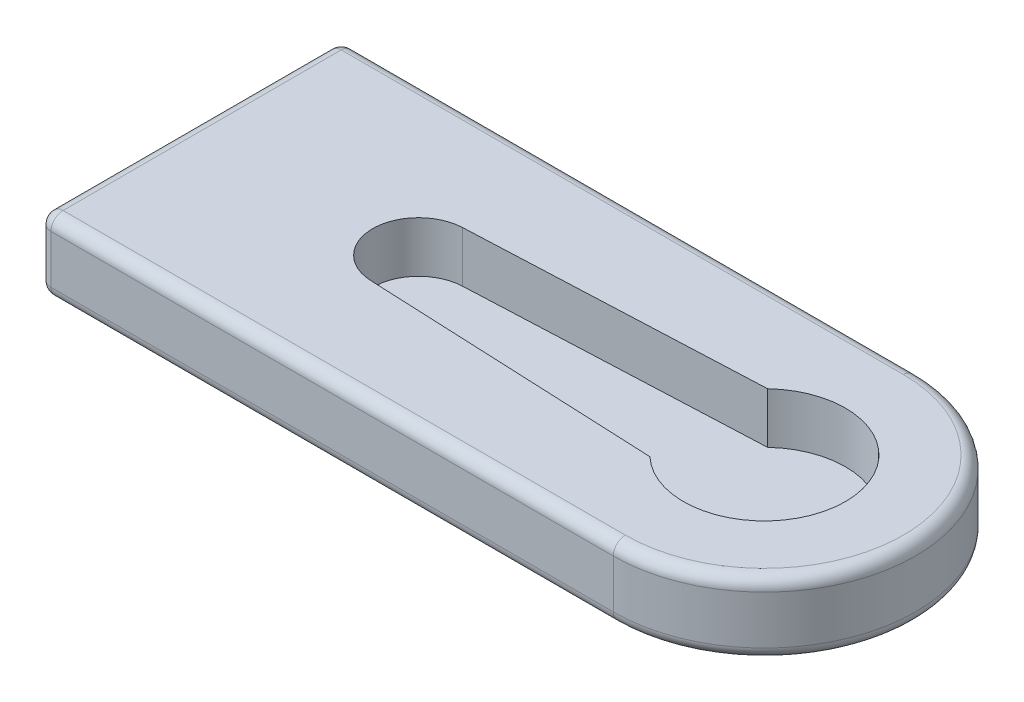
ISO-10303-21;
HEADER;
FILE_DESCRIPTION(('STEP AP214'),'2;1');
FILE_NAME('part.step','',(''),(''),'','','');
FILE_SCHEMA(('AUTOMOTIVE_DESIGN { 1 0 10303 214 1 1 1 1 }'));
ENDSEC;
DATA;
#1=APPLICATION_CONTEXT('core data for automotive mechanical design processes');
#2=APPLICATION_PROTOCOL_DEFINITION('international standard','automotive_design',2000,#1);
#3=PRODUCT_CONTEXT('',#1,'mechanical');
#4=PRODUCT('Part','Part','',(#3));
#5=PRODUCT_RELATED_PRODUCT_CATEGORY('part','',(#4));
#6=PRODUCT_DEFINITION_FORMATION('','',#4);
#7=PRODUCT_DEFINITION_CONTEXT('part definition',#1,'design');
#8=PRODUCT_DEFINITION('design','',#6,#7);
#9=PRODUCT_DEFINITION_SHAPE('','',#8);
#10=(LENGTH_UNIT() NAMED_UNIT(*) SI_UNIT(.MILLI.,.METRE.));
#11=(NAMED_UNIT(*) PLANE_ANGLE_UNIT() SI_UNIT($,.RADIAN.));
#12=(NAMED_UNIT(*) SI_UNIT($,.STERADIAN.) SOLID_ANGLE_UNIT());
#13=UNCERTAINTY_MEASURE_WITH_UNIT(LENGTH_MEASURE(1.E-05),#10,'distance_accuracy_value','');
#14=(GEOMETRIC_REPRESENTATION_CONTEXT(3) GLOBAL_UNCERTAINTY_ASSIGNED_CONTEXT((#13)) GLOBAL_UNIT_ASSIGNED_CONTEXT((#10,
#11,#12)) REPRESENTATION_CONTEXT('',''));
#15=CARTESIAN_POINT('',(0.,0.,0.));
#16=DIRECTION('',(0.,0.,1.));
#17=DIRECTION('',(1.,0.,0.));
#18=AXIS2_PLACEMENT_3D('',#15,#16,#17);
#19=CARTESIAN_POINT('',(0.,3.,0.));
#20=DIRECTION('',(1.,0.,0.));
#21=DIRECTION('',(0.,0.,-1.));
#22=AXIS2_PLACEMENT_3D('',#19,#20,#21);
#23=PLANE('',#22);
#24=DIRECTION('',(0.,0.,1.));
#25=VECTOR('',#24,1.);
#26=CARTESIAN_POINT('',(0.,2.5,-12.5));
#27=LINE('',#26,#25);
#28=CARTESIAN_POINT('',(0.,2.5,-0.5));
#29=VERTEX_POINT('',#28);
#30=CARTESIAN_POINT('',(0.,2.5,-12.));
#31=VERTEX_POINT('',#30);
#32=EDGE_CURVE('E242',#29,#31,#27,.F.);
#33=ORIENTED_EDGE('',*,*,#32,.T.);
#34=DIRECTION('',(0.,-1.,0.));
#35=VECTOR('',#34,1.);
#36=CARTESIAN_POINT('',(0.,3.,-12.));
#37=LINE('',#36,#35);
#38=CARTESIAN_POINT('',(0.,0.5,-12.));
#39=VERTEX_POINT('',#38);
#40=EDGE_CURVE('E249',#31,#39,#37,.T.);
#41=ORIENTED_EDGE('',*,*,#40,.T.);
#42=DIRECTION('',(0.,0.,1.));
#43=VECTOR('',#42,1.);
#44=CARTESIAN_POINT('',(0.,0.5,0.));
#45=LINE('',#44,#43);
#46=CARTESIAN_POINT('',(0.,0.5,-0.5));
#47=VERTEX_POINT('',#46);
#48=EDGE_CURVE('E245',#39,#47,#45,.T.);
#49=ORIENTED_EDGE('',*,*,#48,.T.);
#50=DIRECTION('',(0.,-1.,0.));
#51=VECTOR('',#50,1.);
#52=CARTESIAN_POINT('',(0.,3.,-0.5));
#53=LINE('',#52,#51);
#54=EDGE_CURVE('E239',#47,#29,#53,.F.);
#55=ORIENTED_EDGE('',*,*,#54,.T.);
#56=EDGE_LOOP('',(#33,#41,#49,#55));
#57=FACE_BOUND('',#56,.T.);
#58=ADVANCED_FACE('F39',(#57),#23,.F.);
#59=CARTESIAN_POINT('',(0.,3.,0.));
#60=DIRECTION('',(0.,0.,-1.));
#61=DIRECTION('',(-1.,0.,0.));
#62=AXIS2_PLACEMENT_3D('',#59,#60,#61);
#63=PLANE('',#62);
#64=DIRECTION('',(0.,-1.,0.));
#65=VECTOR('',#64,1.);
#66=CARTESIAN_POINT('',(0.5,3.,0.));
#67=LINE('',#66,#65);
#68=CARTESIAN_POINT('',(0.5,2.5,0.));
#69=VERTEX_POINT('',#68);
#70=CARTESIAN_POINT('',(0.5,0.5,0.));
#71=VERTEX_POINT('',#70);
#72=EDGE_CURVE('E201',#69,#71,#67,.T.);
#73=ORIENTED_EDGE('',*,*,#72,.T.);
#74=DIRECTION('',(1.,0.,0.));
#75=VECTOR('',#74,1.);
#76=CARTESIAN_POINT('',(0.,0.5,0.));
#77=LINE('',#76,#75);
#78=CARTESIAN_POINT('',(23.75,0.5,0.));
#79=VERTEX_POINT('',#78);
#80=EDGE_CURVE('E207',#71,#79,#77,.T.);
#81=ORIENTED_EDGE('',*,*,#80,.T.);
#82=DIRECTION('',(0.,-1.,0.));
#83=VECTOR('',#82,1.);
#84=CARTESIAN_POINT('',(23.75,3.,0.));
#85=LINE('',#84,#83);
#86=CARTESIAN_POINT('',(23.75,2.5,0.));
#87=VERTEX_POINT('',#86);
#88=EDGE_CURVE('E197',#87,#79,#85,.T.);
#89=ORIENTED_EDGE('',*,*,#88,.F.);
#90=DIRECTION('',(1.,0.,0.));
#91=VECTOR('',#90,1.);
#92=CARTESIAN_POINT('',(0.,2.5,0.));
#93=LINE('',#92,#91);
#94=EDGE_CURVE('E204',#87,#69,#93,.F.);
#95=ORIENTED_EDGE('',*,*,#94,.T.);
#96=EDGE_LOOP('',(#73,#81,#89,#95));
#97=FACE_BOUND('',#96,.T.);
#98=ADVANCED_FACE('F347',(#97),#63,.F.);
#99=CARTESIAN_POINT('',(23.75,3.,-6.25));
#100=DIRECTION('',(0.,-1.,0.));
#101=DIRECTION('',(0.,0.,-1.));
#102=AXIS2_PLACEMENT_3D('',#99,#100,#101);
#103=CYLINDRICAL_SURFACE('',#102,6.25);
#104=ORIENTED_EDGE('',*,*,#88,.T.);
#105=CARTESIAN_POINT('',(23.75,0.5,-6.25));
#106=DIRECTION('',(0.,1.,0.));
#107=DIRECTION('',(0.,0.,1.));
#108=AXIS2_PLACEMENT_3D('',#105,#106,#107);
#109=CIRCLE('',#108,6.25);
#110=CARTESIAN_POINT('',(23.75,0.5,-12.5));
#111=VERTEX_POINT('',#110);
#112=EDGE_CURVE('E227',#79,#111,#109,.T.);
#113=ORIENTED_EDGE('',*,*,#112,.T.);
#114=DIRECTION('',(0.,-1.,0.));
#115=VECTOR('',#114,1.);
#116=CARTESIAN_POINT('',(23.75,3.,-12.5));
#117=LINE('',#116,#115);
#118=CARTESIAN_POINT('',(23.75,2.5,-12.5));
#119=VERTEX_POINT('',#118);
#120=EDGE_CURVE('E193',#119,#111,#117,.T.);
#121=ORIENTED_EDGE('',*,*,#120,.F.);
#122=CARTESIAN_POINT('',(23.75,2.5,-6.25));
#123=DIRECTION('',(0.,1.,0.));
#124=DIRECTION('',(0.,0.,1.));
#125=AXIS2_PLACEMENT_3D('',#122,#123,#124);
#126=CIRCLE('',#125,6.25);
#127=EDGE_CURVE('E224',#119,#87,#126,.F.);
#128=ORIENTED_EDGE('',*,*,#127,.T.);
#129=EDGE_LOOP('',(#104,#113,#121,#128));
#130=FACE_BOUND('',#129,.T.);
#131=ADVANCED_FACE('F351',(#130),#103,.T.);
#132=CARTESIAN_POINT('',(0.,3.,-12.5));
#133=DIRECTION('',(0.,0.,1.));
#134=DIRECTION('',(1.,0.,0.));
#135=AXIS2_PLACEMENT_3D('',#132,#133,#134);
#136=PLANE('',#135);
#137=ORIENTED_EDGE('',*,*,#120,.T.);
#138=DIRECTION('',(-1.,0.,0.));
#139=VECTOR('',#138,1.);
#140=CARTESIAN_POINT('',(0.,0.5,-12.5));
#141=LINE('',#140,#139);
#142=CARTESIAN_POINT('',(0.499999999999993,0.5,-12.5));
#143=VERTEX_POINT('',#142);
#144=EDGE_CURVE('E236',#111,#143,#141,.T.);
#145=ORIENTED_EDGE('',*,*,#144,.T.);
#146=DIRECTION('',(0.,-1.,0.));
#147=VECTOR('',#146,1.);
#148=CARTESIAN_POINT('',(0.499999999999993,3.,-12.5));
#149=LINE('',#148,#147);
#150=CARTESIAN_POINT('',(0.499999999999993,2.5,-12.5));
#151=VERTEX_POINT('',#150);
#152=EDGE_CURVE('E230',#143,#151,#149,.F.);
#153=ORIENTED_EDGE('',*,*,#152,.T.);
#154=DIRECTION('',(-1.,0.,0.));
#155=VECTOR('',#154,1.);
#156=CARTESIAN_POINT('',(23.75,2.5,-12.5));
#157=LINE('',#156,#155);
#158=EDGE_CURVE('E233',#151,#119,#157,.F.);
#159=ORIENTED_EDGE('',*,*,#158,.T.);
#160=EDGE_LOOP('',(#137,#145,#153,#159));
#161=FACE_BOUND('',#160,.T.);
#162=ADVANCED_FACE('F356',(#161),#136,.F.);
#163=CARTESIAN_POINT('',(23.75,3.,-6.25));
#164=DIRECTION('',(0.,1.,0.));
#165=DIRECTION('',(0.,0.,1.));
#166=AXIS2_PLACEMENT_3D('',#163,#164,#165);
#167=PLANE('',#166);
#168=CARTESIAN_POINT('',(9.45,3.,-6.25));
#169=DIRECTION('',(0.,1.,0.));
#170=DIRECTION('',(0.,0.,-1.));
#171=AXIS2_PLACEMENT_3D('',#168,#169,#170);
#172=CIRCLE('',#171,1.9);
#173=CARTESIAN_POINT('',(9.36583663711021,3.,-8.14813501320298));
#174=VERTEX_POINT('',#173);
#175=CARTESIAN_POINT('',(9.36583663711021,3.,-4.35186498679702));
#176=VERTEX_POINT('',#175);
#177=EDGE_CURVE('E57',#174,#176,#172,.T.);
#178=ORIENTED_EDGE('',*,*,#177,.F.);
#179=DIRECTION('',(-0.999018428001569,0.,0.0442965067840975));
#180=VECTOR('',#179,1.);
#181=CARTESIAN_POINT('',(9.36583663711021,3.,-8.14813501320298));
#182=LINE('',#181,#180);
#183=CARTESIAN_POINT('',(21.4480845876229,3.,-8.68386224636088));
#184=VERTEX_POINT('',#183);
#185=EDGE_CURVE('E165',#184,#174,#182,.T.);
#186=ORIENTED_EDGE('',*,*,#185,.F.);
#187=CARTESIAN_POINT('',(23.75,3.,-6.25));
#188=DIRECTION('',(0.,1.,0.));
#189=DIRECTION('',(0.,0.,1.));
#190=AXIS2_PLACEMENT_3D('',#187,#188,#189);
#191=CIRCLE('',#190,3.35);
#192=CARTESIAN_POINT('',(21.4480845876229,3.,-3.81613775363912));
#193=VERTEX_POINT('',#192);
#194=EDGE_CURVE('E169',#193,#184,#191,.T.);
#195=ORIENTED_EDGE('',*,*,#194,.F.);
#196=DIRECTION('',(0.999018428001569,0.,0.0442965067840975));
#197=VECTOR('',#196,1.);
#198=CARTESIAN_POINT('',(9.36583663711021,3.,-4.35186498679702));
#199=LINE('',#198,#197);
#200=EDGE_CURVE('E178',#176,#193,#199,.T.);
#201=ORIENTED_EDGE('',*,*,#200,.F.);
#202=EDGE_LOOP('',(#178,#186,#195,#201));
#203=FACE_BOUND('',#202,.T.);
#204=CARTESIAN_POINT('',(23.75,3.,-6.25));
#205=DIRECTION('',(0.,1.,0.));
#206=DIRECTION('',(0.,0.,1.));
#207=AXIS2_PLACEMENT_3D('',#204,#205,#206);
#208=CIRCLE('',#207,5.75);
#209=CARTESIAN_POINT('',(23.75,3.,-0.5));
#210=VERTEX_POINT('',#209);
#211=CARTESIAN_POINT('',(23.75,3.,-12.));
#212=VERTEX_POINT('',#211);
#213=EDGE_CURVE('E49',#210,#212,#208,.T.);
#214=ORIENTED_EDGE('',*,*,#213,.T.);
#215=DIRECTION('',(-1.,0.,0.));
#216=VECTOR('',#215,1.);
#217=CARTESIAN_POINT('',(0.,3.,-12.));
#218=LINE('',#217,#216);
#219=CARTESIAN_POINT('',(0.499999999999994,3.,-12.));
#220=VERTEX_POINT('',#219);
#221=EDGE_CURVE('E11',#212,#220,#218,.T.);
#222=ORIENTED_EDGE('',*,*,#221,.T.);
#223=DIRECTION('',(0.,0.,1.));
#224=VECTOR('',#223,1.);
#225=CARTESIAN_POINT('',(0.5,3.,0.));
#226=LINE('',#225,#224);
#227=CARTESIAN_POINT('',(0.5,3.,-0.5));
#228=VERTEX_POINT('',#227);
#229=EDGE_CURVE('E252',#220,#228,#226,.T.);
#230=ORIENTED_EDGE('',*,*,#229,.T.);
#231=DIRECTION('',(1.,0.,0.));
#232=VECTOR('',#231,1.);
#233=CARTESIAN_POINT('',(23.75,3.,-0.5));
#234=LINE('',#233,#232);
#235=EDGE_CURVE('E255',#228,#210,#234,.T.);
#236=ORIENTED_EDGE('',*,*,#235,.T.);
#237=EDGE_LOOP('',(#214,#222,#230,#236));
#238=FACE_BOUND('',#237,.T.);
#239=ADVANCED_FACE('F327',(#203,#238),#167,.T.);
#240=CARTESIAN_POINT('',(23.75,0.,-6.25));
#241=DIRECTION('',(0.,1.,0.));
#242=DIRECTION('',(0.,0.,1.));
#243=AXIS2_PLACEMENT_3D('',#240,#241,#242);
#244=PLANE('',#243);
#245=CARTESIAN_POINT('',(23.75,0.,-6.25));
#246=DIRECTION('',(0.,1.,0.));
#247=DIRECTION('',(0.,0.,1.));
#248=AXIS2_PLACEMENT_3D('',#245,#246,#247);
#249=CIRCLE('',#248,5.75);
#250=CARTESIAN_POINT('',(23.75,0.,-12.));
#251=VERTEX_POINT('',#250);
#252=CARTESIAN_POINT('',(23.75,0.,-0.5));
#253=VERTEX_POINT('',#252);
#254=EDGE_CURVE('E217',#251,#253,#249,.F.);
#255=ORIENTED_EDGE('',*,*,#254,.T.);
#256=DIRECTION('',(1.,0.,0.));
#257=VECTOR('',#256,1.);
#258=CARTESIAN_POINT('',(23.75,0.,-0.5));
#259=LINE('',#258,#257);
#260=CARTESIAN_POINT('',(0.5,0.,-0.5));
#261=VERTEX_POINT('',#260);
#262=EDGE_CURVE('E220',#253,#261,#259,.F.);
#263=ORIENTED_EDGE('',*,*,#262,.T.);
#264=DIRECTION('',(0.,0.,1.));
#265=VECTOR('',#264,1.);
#266=CARTESIAN_POINT('',(0.499999999999997,0.,-6.24999999999999));
#267=LINE('',#266,#265);
#268=CARTESIAN_POINT('',(0.499999999999993,0.,-12.));
#269=VERTEX_POINT('',#268);
#270=EDGE_CURVE('E211',#261,#269,#267,.F.);
#271=ORIENTED_EDGE('',*,*,#270,.T.);
#272=DIRECTION('',(-1.,0.,0.));
#273=VECTOR('',#272,1.);
#274=CARTESIAN_POINT('',(23.75,0.,-12.));
#275=LINE('',#274,#273);
#276=EDGE_CURVE('E214',#269,#251,#275,.F.);
#277=ORIENTED_EDGE('',*,*,#276,.T.);
#278=EDGE_LOOP('',(#255,#263,#271,#277));
#279=FACE_BOUND('',#278,.T.);
#280=ADVANCED_FACE('F369',(#279),#244,.F.);
#281=CARTESIAN_POINT('',(23.75,2.5,-12.));
#282=DIRECTION('',(1.,0.,0.));
#283=DIRECTION('',(0.,0.,-1.));
#284=AXIS2_PLACEMENT_3D('',#281,#282,#283);
#285=CYLINDRICAL_SURFACE('',#284,0.5);
#286=CARTESIAN_POINT('',(0.499999999999994,2.5,-12.));
#287=DIRECTION('',(-1.,0.,0.));
#288=DIRECTION('',(0.,0.,1.));
#289=AXIS2_PLACEMENT_3D('',#286,#287,#288);
#290=CIRCLE('',#289,0.5);
#291=EDGE_CURVE('E311',#220,#151,#290,.T.);
#292=ORIENTED_EDGE('',*,*,#291,.F.);
#293=ORIENTED_EDGE('',*,*,#221,.F.);
#294=CARTESIAN_POINT('',(23.75,2.5,-12.));
#295=DIRECTION('',(1.,0.,0.));
#296=DIRECTION('',(0.,0.,-1.));
#297=AXIS2_PLACEMENT_3D('',#294,#295,#296);
#298=CIRCLE('',#297,0.5);
#299=EDGE_CURVE('E43',#119,#212,#298,.T.);
#300=ORIENTED_EDGE('',*,*,#299,.F.);
#301=ORIENTED_EDGE('',*,*,#158,.F.);
#302=EDGE_LOOP('',(#292,#293,#300,#301));
#303=FACE_BOUND('',#302,.T.);
#304=ADVANCED_FACE('F41',(#303),#285,.T.);
#305=CARTESIAN_POINT('',(23.75,2.5,-6.25));
#306=DIRECTION('',(0.,1.,0.));
#307=DIRECTION('',(0.,0.,1.));
#308=AXIS2_PLACEMENT_3D('',#305,#306,#307);
#309=TOROIDAL_SURFACE('',#308,5.75,0.5);
#310=ORIENTED_EDGE('',*,*,#299,.T.);
#311=ORIENTED_EDGE('',*,*,#213,.F.);
#312=CARTESIAN_POINT('',(23.75,2.5,-0.5));
#313=DIRECTION('',(-1.,0.,0.));
#314=DIRECTION('',(0.,0.,1.));
#315=AXIS2_PLACEMENT_3D('',#312,#313,#314);
#316=CIRCLE('',#315,0.5);
#317=EDGE_CURVE('E304',#87,#210,#316,.T.);
#318=ORIENTED_EDGE('',*,*,#317,.F.);
#319=ORIENTED_EDGE('',*,*,#127,.F.);
#320=EDGE_LOOP('',(#310,#311,#318,#319));
#321=FACE_BOUND('',#320,.T.);
#322=ADVANCED_FACE('F323',(#321),#309,.T.);
#323=CARTESIAN_POINT('',(0.499999999999993,2.5,-12.));
#324=DIRECTION('',(0.,1.,0.));
#325=DIRECTION('',(-1.,0.,0.));
#326=AXIS2_PLACEMENT_3D('',#323,#324,#325);
#327=SPHERICAL_SURFACE('',#326,0.5);
#328=CARTESIAN_POINT('',(0.499999999999993,2.5,-12.));
#329=DIRECTION('',(0.,1.,0.));
#330=DIRECTION('',(0.,0.,1.));
#331=AXIS2_PLACEMENT_3D('',#328,#329,#330);
#332=CIRCLE('',#331,0.5);
#333=EDGE_CURVE('E300',#31,#151,#332,.F.);
#334=ORIENTED_EDGE('',*,*,#333,.F.);
#335=CARTESIAN_POINT('',(0.499999999999993,2.5,-12.));
#336=DIRECTION('',(0.,0.,-1.));
#337=DIRECTION('',(-1.,0.,0.));
#338=AXIS2_PLACEMENT_3D('',#335,#336,#337);
#339=CIRCLE('',#338,0.5);
#340=EDGE_CURVE('E308',#220,#31,#339,.F.);
#341=ORIENTED_EDGE('',*,*,#340,.F.);
#342=ORIENTED_EDGE('',*,*,#291,.T.);
#343=EDGE_LOOP('',(#334,#341,#342));
#344=FACE_BOUND('',#343,.T.);
#345=ADVANCED_FACE('F386',(#344),#327,.T.);
#346=CARTESIAN_POINT('',(0.499999999999997,2.5,-6.24999999999999));
#347=DIRECTION('',(0.,0.,-1.));
#348=DIRECTION('',(-1.,0.,0.));
#349=AXIS2_PLACEMENT_3D('',#346,#347,#348);
#350=CYLINDRICAL_SURFACE('',#349,0.5);
#351=ORIENTED_EDGE('',*,*,#340,.T.);
#352=ORIENTED_EDGE('',*,*,#32,.F.);
#353=CARTESIAN_POINT('',(0.5,2.5,-0.5));
#354=DIRECTION('',(0.,0.,1.));
#355=DIRECTION('',(1.,0.,0.));
#356=AXIS2_PLACEMENT_3D('',#353,#354,#355);
#357=CIRCLE('',#356,0.5);
#358=EDGE_CURVE('E296',#228,#29,#357,.T.);
#359=ORIENTED_EDGE('',*,*,#358,.F.);
#360=ORIENTED_EDGE('',*,*,#229,.F.);
#361=EDGE_LOOP('',(#351,#352,#359,#360));
#362=FACE_BOUND('',#361,.T.);
#363=ADVANCED_FACE('F337',(#362),#350,.T.);
#364=CARTESIAN_POINT('',(23.75,2.5,-0.5));
#365=DIRECTION('',(-1.,0.,0.));
#366=DIRECTION('',(0.,0.,1.));
#367=AXIS2_PLACEMENT_3D('',#364,#365,#366);
#368=CYLINDRICAL_SURFACE('',#367,0.5);
#369=ORIENTED_EDGE('',*,*,#317,.T.);
#370=ORIENTED_EDGE('',*,*,#235,.F.);
#371=CARTESIAN_POINT('',(0.5,2.5,-0.5));
#372=DIRECTION('',(-1.,0.,0.));
#373=DIRECTION('',(0.,-1.,0.));
#374=AXIS2_PLACEMENT_3D('',#371,#372,#373);
#375=CIRCLE('',#374,0.5);
#376=EDGE_CURVE('E292',#69,#228,#375,.T.);
#377=ORIENTED_EDGE('',*,*,#376,.F.);
#378=ORIENTED_EDGE('',*,*,#94,.F.);
#379=EDGE_LOOP('',(#369,#370,#377,#378));
#380=FACE_BOUND('',#379,.T.);
#381=ADVANCED_FACE('F333',(#380),#368,.T.);
#382=CARTESIAN_POINT('',(0.499999999999993,3.,-12.));
#383=DIRECTION('',(0.,-1.,0.));
#384=DIRECTION('',(0.,0.,-1.));
#385=AXIS2_PLACEMENT_3D('',#382,#383,#384);
#386=CYLINDRICAL_SURFACE('',#385,0.5);
#387=ORIENTED_EDGE('',*,*,#333,.T.);
#388=ORIENTED_EDGE('',*,*,#152,.F.);
#389=CARTESIAN_POINT('',(0.499999999999993,0.5,-12.));
#390=DIRECTION('',(0.,-1.,0.));
#391=DIRECTION('',(0.,0.,-1.));
#392=AXIS2_PLACEMENT_3D('',#389,#390,#391);
#393=CIRCLE('',#392,0.5);
#394=EDGE_CURVE('E288',#39,#143,#393,.T.);
#395=ORIENTED_EDGE('',*,*,#394,.F.);
#396=ORIENTED_EDGE('',*,*,#40,.F.);
#397=EDGE_LOOP('',(#387,#388,#395,#396));
#398=FACE_BOUND('',#397,.T.);
#399=ADVANCED_FACE('F385',(#398),#386,.T.);
#400=CARTESIAN_POINT('',(0.5,2.5,-0.5));
#401=DIRECTION('',(0.,1.,0.));
#402=DIRECTION('',(0.,0.,1.));
#403=AXIS2_PLACEMENT_3D('',#400,#401,#402);
#404=SPHERICAL_SURFACE('',#403,0.5);
#405=ORIENTED_EDGE('',*,*,#376,.T.);
#406=ORIENTED_EDGE('',*,*,#358,.T.);
#407=CARTESIAN_POINT('',(0.5,2.5,-0.5));
#408=DIRECTION('',(0.,1.,0.));
#409=DIRECTION('',(0.,0.,1.));
#410=AXIS2_PLACEMENT_3D('',#407,#408,#409);
#411=CIRCLE('',#410,0.5);
#412=EDGE_CURVE('E280',#69,#29,#411,.F.);
#413=ORIENTED_EDGE('',*,*,#412,.F.);
#414=EDGE_LOOP('',(#405,#406,#413));
#415=FACE_BOUND('',#414,.T.);
#416=ADVANCED_FACE('F339',(#415),#404,.T.);
#417=CARTESIAN_POINT('',(0.499999999999993,0.5,-12.));
#418=DIRECTION('',(-1.,0.,0.));
#419=DIRECTION('',(0.,0.,1.));
#420=AXIS2_PLACEMENT_3D('',#417,#418,#419);
#421=SPHERICAL_SURFACE('',#420,0.5);
#422=CARTESIAN_POINT('',(0.499999999999993,0.5,-12.));
#423=DIRECTION('',(-1.,0.,0.));
#424=DIRECTION('',(0.,0.,1.));
#425=AXIS2_PLACEMENT_3D('',#422,#423,#424);
#426=CIRCLE('',#425,0.5);
#427=EDGE_CURVE('E276',#269,#143,#426,.F.);
#428=ORIENTED_EDGE('',*,*,#427,.F.);
#429=CARTESIAN_POINT('',(0.499999999999993,0.5,-12.));
#430=DIRECTION('',(0.,0.,-1.));
#431=DIRECTION('',(-1.,0.,0.));
#432=AXIS2_PLACEMENT_3D('',#429,#430,#431);
#433=CIRCLE('',#432,0.5);
#434=EDGE_CURVE('E284',#39,#269,#433,.F.);
#435=ORIENTED_EDGE('',*,*,#434,.F.);
#436=ORIENTED_EDGE('',*,*,#394,.T.);
#437=EDGE_LOOP('',(#428,#435,#436));
#438=FACE_BOUND('',#437,.T.);
#439=ADVANCED_FACE('F381',(#438),#421,.T.);
#440=CARTESIAN_POINT('',(0.5,0.5,0.));
#441=DIRECTION('',(0.,0.,1.));
#442=DIRECTION('',(1.,0.,0.));
#443=AXIS2_PLACEMENT_3D('',#440,#441,#442);
#444=CYLINDRICAL_SURFACE('',#443,0.5);
#445=ORIENTED_EDGE('',*,*,#434,.T.);
#446=ORIENTED_EDGE('',*,*,#270,.F.);
#447=CARTESIAN_POINT('',(0.5,0.5,-0.5));
#448=DIRECTION('',(0.,0.,1.));
#449=DIRECTION('',(1.,0.,0.));
#450=AXIS2_PLACEMENT_3D('',#447,#448,#449);
#451=CIRCLE('',#450,0.5);
#452=EDGE_CURVE('E272',#47,#261,#451,.T.);
#453=ORIENTED_EDGE('',*,*,#452,.F.);
#454=ORIENTED_EDGE('',*,*,#48,.F.);
#455=EDGE_LOOP('',(#445,#446,#453,#454));
#456=FACE_BOUND('',#455,.T.);
#457=ADVANCED_FACE('F378',(#456),#444,.T.);
#458=CARTESIAN_POINT('',(0.5,3.,-0.5));
#459=DIRECTION('',(0.,-1.,0.));
#460=DIRECTION('',(0.,0.,-1.));
#461=AXIS2_PLACEMENT_3D('',#458,#459,#460);
#462=CYLINDRICAL_SURFACE('',#461,0.5);
#463=ORIENTED_EDGE('',*,*,#412,.T.);
#464=ORIENTED_EDGE('',*,*,#54,.F.);
#465=CARTESIAN_POINT('',(0.5,0.5,-0.5));
#466=DIRECTION('',(0.,-1.,0.));
#467=DIRECTION('',(0.,0.,-1.));
#468=AXIS2_PLACEMENT_3D('',#465,#466,#467);
#469=CIRCLE('',#468,0.5);
#470=EDGE_CURVE('E269',#71,#47,#469,.T.);
#471=ORIENTED_EDGE('',*,*,#470,.F.);
#472=ORIENTED_EDGE('',*,*,#72,.F.);
#473=EDGE_LOOP('',(#463,#464,#471,#472));
#474=FACE_BOUND('',#473,.T.);
#475=ADVANCED_FACE('F344',(#474),#462,.T.);
#476=CARTESIAN_POINT('',(0.,0.5,-12.));
#477=DIRECTION('',(-1.,0.,0.));
#478=DIRECTION('',(0.,0.,1.));
#479=AXIS2_PLACEMENT_3D('',#476,#477,#478);
#480=CYLINDRICAL_SURFACE('',#479,0.5);
#481=ORIENTED_EDGE('',*,*,#427,.T.);
#482=ORIENTED_EDGE('',*,*,#144,.F.);
#483=CARTESIAN_POINT('',(23.75,0.5,-12.));
#484=DIRECTION('',(1.,0.,0.));
#485=DIRECTION('',(0.,0.,-1.));
#486=AXIS2_PLACEMENT_3D('',#483,#484,#485);
#487=CIRCLE('',#486,0.5);
#488=EDGE_CURVE('E265',#251,#111,#487,.T.);
#489=ORIENTED_EDGE('',*,*,#488,.F.);
#490=ORIENTED_EDGE('',*,*,#276,.F.);
#491=EDGE_LOOP('',(#481,#482,#489,#490));
#492=FACE_BOUND('',#491,.T.);
#493=ADVANCED_FACE('F360',(#492),#480,.T.);
#494=CARTESIAN_POINT('',(0.5,0.5,-0.5));
#495=DIRECTION('',(-1.,0.,0.));
#496=DIRECTION('',(0.,0.,1.));
#497=AXIS2_PLACEMENT_3D('',#494,#495,#496);
#498=SPHERICAL_SURFACE('',#497,0.5);
#499=ORIENTED_EDGE('',*,*,#470,.T.);
#500=ORIENTED_EDGE('',*,*,#452,.T.);
#501=CARTESIAN_POINT('',(0.5,0.5,-0.5));
#502=DIRECTION('',(-1.,0.,0.));
#503=DIRECTION('',(0.,0.,1.));
#504=AXIS2_PLACEMENT_3D('',#501,#502,#503);
#505=CIRCLE('',#504,0.5);
#506=EDGE_CURVE('E262',#71,#261,#505,.F.);
#507=ORIENTED_EDGE('',*,*,#506,.F.);
#508=EDGE_LOOP('',(#499,#500,#507));
#509=FACE_BOUND('',#508,.T.);
#510=ADVANCED_FACE('F375',(#509),#498,.T.);
#511=CARTESIAN_POINT('',(23.75,0.5,-6.25));
#512=DIRECTION('',(0.,1.,0.));
#513=DIRECTION('',(0.,0.,1.));
#514=AXIS2_PLACEMENT_3D('',#511,#512,#513);
#515=TOROIDAL_SURFACE('',#514,5.75,0.5);
#516=ORIENTED_EDGE('',*,*,#488,.T.);
#517=ORIENTED_EDGE('',*,*,#112,.F.);
#518=CARTESIAN_POINT('',(23.75,0.5,-0.5));
#519=DIRECTION('',(-1.,0.,0.));
#520=DIRECTION('',(0.,0.,1.));
#521=AXIS2_PLACEMENT_3D('',#518,#519,#520);
#522=CIRCLE('',#521,0.5);
#523=EDGE_CURVE('E187',#253,#79,#522,.T.);
#524=ORIENTED_EDGE('',*,*,#523,.F.);
#525=ORIENTED_EDGE('',*,*,#254,.F.);
#526=EDGE_LOOP('',(#516,#517,#524,#525));
#527=FACE_BOUND('',#526,.T.);
#528=ADVANCED_FACE('F365',(#527),#515,.T.);
#529=CARTESIAN_POINT('',(0.,0.5,-0.5));
#530=DIRECTION('',(1.,0.,0.));
#531=DIRECTION('',(0.,0.,-1.));
#532=AXIS2_PLACEMENT_3D('',#529,#530,#531);
#533=CYLINDRICAL_SURFACE('',#532,0.5);
#534=ORIENTED_EDGE('',*,*,#506,.T.);
#535=ORIENTED_EDGE('',*,*,#262,.F.);
#536=ORIENTED_EDGE('',*,*,#523,.T.);
#537=ORIENTED_EDGE('',*,*,#80,.F.);
#538=EDGE_LOOP('',(#534,#535,#536,#537));
#539=FACE_BOUND('',#538,.T.);
#540=ADVANCED_FACE('F371',(#539),#533,.T.);
#541=CARTESIAN_POINT('',(9.45,0.9,-6.25));
#542=DIRECTION('',(0.,1.,0.));
#543=DIRECTION('',(0.,0.,1.));
#544=AXIS2_PLACEMENT_3D('',#541,#542,#543);
#545=CYLINDRICAL_SURFACE('',#544,1.9);
#546=ORIENTED_EDGE('',*,*,#177,.T.);
#547=DIRECTION('',(0.,1.,0.));
#548=VECTOR('',#547,1.);
#549=CARTESIAN_POINT('',(9.36583663711021,0.9,-4.35186498679702));
#550=LINE('',#549,#548);
#551=CARTESIAN_POINT('',(9.36583663711021,0.9,-4.35186498679702));
#552=VERTEX_POINT('',#551);
#553=EDGE_CURVE('E140',#552,#176,#550,.T.);
#554=ORIENTED_EDGE('',*,*,#553,.F.);
#555=CARTESIAN_POINT('',(9.45,0.9,-6.25));
#556=DIRECTION('',(0.,1.,0.));
#557=DIRECTION('',(0.,0.,-1.));
#558=AXIS2_PLACEMENT_3D('',#555,#556,#557);
#559=CIRCLE('',#558,1.9);
#560=CARTESIAN_POINT('',(9.36583663711021,0.9,-8.14813501320298));
#561=VERTEX_POINT('',#560);
#562=EDGE_CURVE('E144',#561,#552,#559,.T.);
#563=ORIENTED_EDGE('',*,*,#562,.F.);
#564=DIRECTION('',(0.,1.,0.));
#565=VECTOR('',#564,1.);
#566=CARTESIAN_POINT('',(9.36583663711021,0.9,-8.14813501320298));
#567=LINE('',#566,#565);
#568=EDGE_CURVE('E184',#561,#174,#567,.T.);
#569=ORIENTED_EDGE('',*,*,#568,.T.);
#570=EDGE_LOOP('',(#546,#554,#563,#569));
#571=FACE_BOUND('',#570,.T.);
#572=ADVANCED_FACE('F142',(#571),#545,.F.);
#573=CARTESIAN_POINT('',(9.36583663711021,0.9,-8.14813501320298));
#574=DIRECTION('',(-0.0442965067840975,0.,-0.999018428001569));
#575=DIRECTION('',(-0.999018428001569,0.,0.0442965067840975));
#576=AXIS2_PLACEMENT_3D('',#573,#574,#575);
#577=PLANE('',#576);
#578=ORIENTED_EDGE('',*,*,#185,.T.);
#579=ORIENTED_EDGE('',*,*,#568,.F.);
#580=DIRECTION('',(-0.999018428001569,0.,0.0442965067840975));
#581=VECTOR('',#580,1.);
#582=CARTESIAN_POINT('',(9.36583663711021,0.9,-8.14813501320298));
#583=LINE('',#582,#581);
#584=CARTESIAN_POINT('',(21.4480845876229,0.9,-8.68386224636088));
#585=VERTEX_POINT('',#584);
#586=EDGE_CURVE('E151',#585,#561,#583,.T.);
#587=ORIENTED_EDGE('',*,*,#586,.F.);
#588=DIRECTION('',(0.,1.,0.));
#589=VECTOR('',#588,1.);
#590=CARTESIAN_POINT('',(21.4480845876229,0.9,-8.68386224636088));
#591=LINE('',#590,#589);
#592=EDGE_CURVE('E188',#585,#184,#591,.T.);
#593=ORIENTED_EDGE('',*,*,#592,.T.);
#594=EDGE_LOOP('',(#578,#579,#587,#593));
#595=FACE_BOUND('',#594,.T.);
#596=ADVANCED_FACE('F469',(#595),#577,.F.);
#597=CARTESIAN_POINT('',(23.75,0.9,-6.25));
#598=DIRECTION('',(0.,1.,0.));
#599=DIRECTION('',(0.,0.,1.));
#600=AXIS2_PLACEMENT_3D('',#597,#598,#599);
#601=CYLINDRICAL_SURFACE('',#600,3.35);
#602=ORIENTED_EDGE('',*,*,#194,.T.);
#603=ORIENTED_EDGE('',*,*,#592,.F.);
#604=CARTESIAN_POINT('',(23.75,0.9,-6.25));
#605=DIRECTION('',(0.,1.,0.));
#606=DIRECTION('',(0.,0.,1.));
#607=AXIS2_PLACEMENT_3D('',#604,#605,#606);
#608=CIRCLE('',#607,3.35);
#609=CARTESIAN_POINT('',(21.4480845876229,0.9,-3.81613775363912));
#610=VERTEX_POINT('',#609);
#611=EDGE_CURVE('E160',#610,#585,#608,.T.);
#612=ORIENTED_EDGE('',*,*,#611,.F.);
#613=DIRECTION('',(0.,1.,0.));
#614=VECTOR('',#613,1.);
#615=CARTESIAN_POINT('',(21.4480845876229,0.9,-3.81613775363912));
#616=LINE('',#615,#614);
#617=EDGE_CURVE('E150',#610,#193,#616,.T.);
#618=ORIENTED_EDGE('',*,*,#617,.T.);
#619=EDGE_LOOP('',(#602,#603,#612,#618));
#620=FACE_BOUND('',#619,.T.);
#621=ADVANCED_FACE('F476',(#620),#601,.F.);
#622=CARTESIAN_POINT('',(9.36583663711021,0.9,-4.35186498679702));
#623=DIRECTION('',(-0.0442965067840975,0.,0.999018428001569));
#624=DIRECTION('',(0.999018428001569,0.,0.0442965067840975));
#625=AXIS2_PLACEMENT_3D('',#622,#623,#624);
#626=PLANE('',#625);
#627=ORIENTED_EDGE('',*,*,#200,.T.);
#628=ORIENTED_EDGE('',*,*,#617,.F.);
#629=DIRECTION('',(0.999018428001569,0.,0.0442965067840975));
#630=VECTOR('',#629,1.);
#631=CARTESIAN_POINT('',(9.36583663711021,0.9,-4.35186498679702));
#632=LINE('',#631,#630);
#633=EDGE_CURVE('E154',#552,#610,#632,.T.);
#634=ORIENTED_EDGE('',*,*,#633,.F.);
#635=ORIENTED_EDGE('',*,*,#553,.T.);
#636=EDGE_LOOP('',(#627,#628,#634,#635));
#637=FACE_BOUND('',#636,.T.);
#638=ADVANCED_FACE('F155',(#637),#626,.F.);
#639=CARTESIAN_POINT('',(9.45,0.9,-6.25));
#640=DIRECTION('',(0.,-1.,0.));
#641=DIRECTION('',(0.,0.,-1.));
#642=AXIS2_PLACEMENT_3D('',#639,#640,#641);
#643=PLANE('',#642);
#644=ORIENTED_EDGE('',*,*,#562,.T.);
#645=ORIENTED_EDGE('',*,*,#633,.T.);
#646=ORIENTED_EDGE('',*,*,#611,.T.);
#647=ORIENTED_EDGE('',*,*,#586,.T.);
#648=EDGE_LOOP('',(#644,#645,#646,#647));
#649=FACE_BOUND('',#648,.T.);
#650=ADVANCED_FACE('F162',(#649),#643,.F.);
#651=CLOSED_SHELL('',(#58,#98,#131,#162,#239,#280,#304,#322,#345,#363,#381,#399,#416,#439,#457,
#475,#493,#510,#528,#540,#572,#596,#621,#638,#650));
#652=MANIFOLD_SOLID_BREP('B2',#651);
#653=ADVANCED_BREP_SHAPE_REPRESENTATION('',(#18,#652),#14);
#654=SHAPE_DEFINITION_REPRESENTATION(#9,#653);
ENDSEC;
END-ISO-10303-21;
